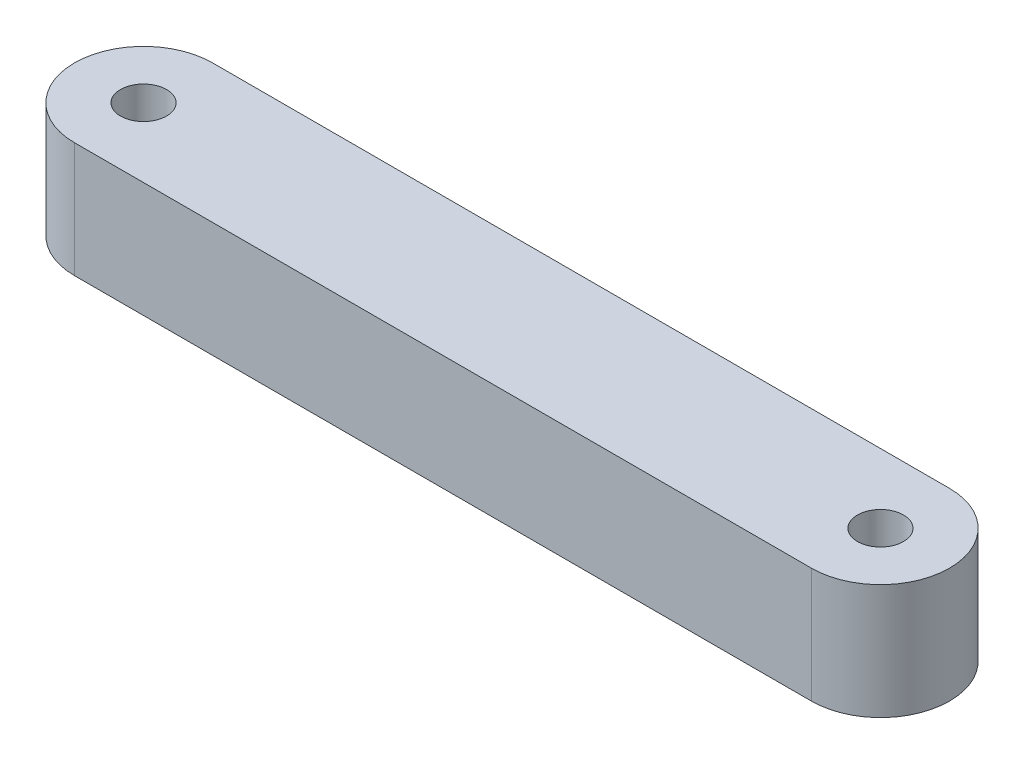
ISO-10303-21;
HEADER;
FILE_DESCRIPTION(('STEP AP214'),'2;1');
FILE_NAME('part.step','',(''),(''),'','','');
FILE_SCHEMA(('AUTOMOTIVE_DESIGN { 1 0 10303 214 1 1 1 1 }'));
ENDSEC;
DATA;
#1=APPLICATION_CONTEXT('core data for automotive mechanical design processes');
#2=APPLICATION_PROTOCOL_DEFINITION('international standard','automotive_design',2000,#1);
#3=PRODUCT_CONTEXT('',#1,'mechanical');
#4=PRODUCT('Part','Part','',(#3));
#5=PRODUCT_RELATED_PRODUCT_CATEGORY('part','',(#4));
#6=PRODUCT_DEFINITION_FORMATION('','',#4);
#7=PRODUCT_DEFINITION_CONTEXT('part definition',#1,'design');
#8=PRODUCT_DEFINITION('design','',#6,#7);
#9=PRODUCT_DEFINITION_SHAPE('','',#8);
#10=(LENGTH_UNIT() NAMED_UNIT(*) SI_UNIT(.MILLI.,.METRE.));
#11=(NAMED_UNIT(*) PLANE_ANGLE_UNIT() SI_UNIT($,.RADIAN.));
#12=(NAMED_UNIT(*) SI_UNIT($,.STERADIAN.) SOLID_ANGLE_UNIT());
#13=UNCERTAINTY_MEASURE_WITH_UNIT(LENGTH_MEASURE(1.E-05),#10,'distance_accuracy_value','');
#14=(GEOMETRIC_REPRESENTATION_CONTEXT(3) GLOBAL_UNCERTAINTY_ASSIGNED_CONTEXT((#13)) GLOBAL_UNIT_ASSIGNED_CONTEXT((#10,
#11,#12)) REPRESENTATION_CONTEXT('',''));
#15=CARTESIAN_POINT('',(0.,0.,0.));
#16=DIRECTION('',(0.,0.,1.));
#17=DIRECTION('',(1.,0.,0.));
#18=AXIS2_PLACEMENT_3D('',#15,#16,#17);
#19=CARTESIAN_POINT('',(-50.8,12.7,0.));
#20=DIRECTION('',(0.,-1.,0.));
#21=DIRECTION('',(0.,0.,-1.));
#22=AXIS2_PLACEMENT_3D('',#19,#20,#21);
#23=CYLINDRICAL_SURFACE('',#22,7.62);
#24=CARTESIAN_POINT('',(-50.8,0.,0.));
#25=DIRECTION('',(0.,1.,0.));
#26=DIRECTION('',(0.,0.,1.));
#27=AXIS2_PLACEMENT_3D('',#24,#25,#26);
#28=CIRCLE('',#27,7.62);
#29=CARTESIAN_POINT('',(-50.8,0.,-7.62));
#30=VERTEX_POINT('',#29);
#31=CARTESIAN_POINT('',(-50.8,0.,7.62));
#32=VERTEX_POINT('',#31);
#33=EDGE_CURVE('E102',#30,#32,#28,.T.);
#34=ORIENTED_EDGE('',*,*,#33,.T.);
#35=DIRECTION('',(0.,-1.,0.));
#36=VECTOR('',#35,1.);
#37=CARTESIAN_POINT('',(-50.8,12.7,7.62));
#38=LINE('',#37,#36);
#39=CARTESIAN_POINT('',(-50.8,12.7,7.62));
#40=VERTEX_POINT('',#39);
#41=EDGE_CURVE('E11',#40,#32,#38,.T.);
#42=ORIENTED_EDGE('',*,*,#41,.F.);
#43=CARTESIAN_POINT('',(-50.8,12.7,0.));
#44=DIRECTION('',(0.,1.,0.));
#45=DIRECTION('',(0.,0.,1.));
#46=AXIS2_PLACEMENT_3D('',#43,#44,#45);
#47=CIRCLE('',#46,7.62);
#48=CARTESIAN_POINT('',(-50.8,12.7,-7.62));
#49=VERTEX_POINT('',#48);
#50=EDGE_CURVE('E90',#49,#40,#47,.T.);
#51=ORIENTED_EDGE('',*,*,#50,.F.);
#52=DIRECTION('',(0.,-1.,0.));
#53=VECTOR('',#52,1.);
#54=CARTESIAN_POINT('',(-50.8,12.7,-7.62));
#55=LINE('',#54,#53);
#56=EDGE_CURVE('E98',#49,#30,#55,.T.);
#57=ORIENTED_EDGE('',*,*,#56,.T.);
#58=EDGE_LOOP('',(#34,#42,#51,#57));
#59=FACE_BOUND('',#58,.T.);
#60=ADVANCED_FACE('F39',(#59),#23,.T.);
#61=CARTESIAN_POINT('',(-50.8,12.7,7.62));
#62=DIRECTION('',(0.,0.,-1.));
#63=DIRECTION('',(-1.,0.,0.));
#64=AXIS2_PLACEMENT_3D('',#61,#62,#63);
#65=PLANE('',#64);
#66=DIRECTION('',(1.,0.,0.));
#67=VECTOR('',#66,1.);
#68=CARTESIAN_POINT('',(-50.8,0.,7.62));
#69=LINE('',#68,#67);
#70=CARTESIAN_POINT('',(30.48,0.,7.62));
#71=VERTEX_POINT('',#70);
#72=EDGE_CURVE('E94',#32,#71,#69,.T.);
#73=ORIENTED_EDGE('',*,*,#72,.T.);
#74=DIRECTION('',(0.,-1.,0.));
#75=VECTOR('',#74,1.);
#76=CARTESIAN_POINT('',(30.48,12.7,7.62));
#77=LINE('',#76,#75);
#78=CARTESIAN_POINT('',(30.48,12.7,7.62));
#79=VERTEX_POINT('',#78);
#80=EDGE_CURVE('E47',#79,#71,#77,.T.);
#81=ORIENTED_EDGE('',*,*,#80,.F.);
#82=DIRECTION('',(1.,0.,0.));
#83=VECTOR('',#82,1.);
#84=CARTESIAN_POINT('',(-50.8,12.7,7.62));
#85=LINE('',#84,#83);
#86=EDGE_CURVE('E85',#40,#79,#85,.T.);
#87=ORIENTED_EDGE('',*,*,#86,.F.);
#88=ORIENTED_EDGE('',*,*,#41,.T.);
#89=EDGE_LOOP('',(#73,#81,#87,#88));
#90=FACE_BOUND('',#89,.T.);
#91=ADVANCED_FACE('F93',(#90),#65,.F.);
#92=CARTESIAN_POINT('',(30.48,12.7,0.));
#93=DIRECTION('',(0.,-1.,0.));
#94=DIRECTION('',(0.,0.,-1.));
#95=AXIS2_PLACEMENT_3D('',#92,#93,#94);
#96=CYLINDRICAL_SURFACE('',#95,7.62);
#97=CARTESIAN_POINT('',(30.48,0.,0.));
#98=DIRECTION('',(0.,1.,0.));
#99=DIRECTION('',(0.,0.,1.));
#100=AXIS2_PLACEMENT_3D('',#97,#98,#99);
#101=CIRCLE('',#100,7.62);
#102=CARTESIAN_POINT('',(30.48,0.,-7.62));
#103=VERTEX_POINT('',#102);
#104=EDGE_CURVE('E72',#71,#103,#101,.T.);
#105=ORIENTED_EDGE('',*,*,#104,.T.);
#106=DIRECTION('',(0.,-1.,0.));
#107=VECTOR('',#106,1.);
#108=CARTESIAN_POINT('',(30.48,12.7,-7.62));
#109=LINE('',#108,#107);
#110=CARTESIAN_POINT('',(30.48,12.7,-7.62));
#111=VERTEX_POINT('',#110);
#112=EDGE_CURVE('E95',#111,#103,#109,.T.);
#113=ORIENTED_EDGE('',*,*,#112,.F.);
#114=CARTESIAN_POINT('',(30.48,12.7,0.));
#115=DIRECTION('',(0.,1.,0.));
#116=DIRECTION('',(0.,0.,1.));
#117=AXIS2_PLACEMENT_3D('',#114,#115,#116);
#118=CIRCLE('',#117,7.62);
#119=EDGE_CURVE('E88',#79,#111,#118,.T.);
#120=ORIENTED_EDGE('',*,*,#119,.F.);
#121=ORIENTED_EDGE('',*,*,#80,.T.);
#122=EDGE_LOOP('',(#105,#113,#120,#121));
#123=FACE_BOUND('',#122,.T.);
#124=ADVANCED_FACE('F96',(#123),#96,.T.);
#125=CARTESIAN_POINT('',(-50.8,12.7,-7.62));
#126=DIRECTION('',(0.,0.,1.));
#127=DIRECTION('',(1.,0.,0.));
#128=AXIS2_PLACEMENT_3D('',#125,#126,#127);
#129=PLANE('',#128);
#130=DIRECTION('',(-1.,0.,0.));
#131=VECTOR('',#130,1.);
#132=CARTESIAN_POINT('',(-50.8,0.,-7.62));
#133=LINE('',#132,#131);
#134=EDGE_CURVE('E78',#103,#30,#133,.T.);
#135=ORIENTED_EDGE('',*,*,#134,.T.);
#136=ORIENTED_EDGE('',*,*,#56,.F.);
#137=DIRECTION('',(-1.,0.,0.));
#138=VECTOR('',#137,1.);
#139=CARTESIAN_POINT('',(-50.8,12.7,-7.62));
#140=LINE('',#139,#138);
#141=EDGE_CURVE('E55',#111,#49,#140,.T.);
#142=ORIENTED_EDGE('',*,*,#141,.F.);
#143=ORIENTED_EDGE('',*,*,#112,.T.);
#144=EDGE_LOOP('',(#135,#136,#142,#143));
#145=FACE_BOUND('',#144,.T.);
#146=ADVANCED_FACE('F110',(#145),#129,.F.);
#147=CARTESIAN_POINT('',(-50.8,12.7,0.));
#148=DIRECTION('',(0.,1.,0.));
#149=DIRECTION('',(0.,0.,1.));
#150=AXIS2_PLACEMENT_3D('',#147,#148,#149);
#151=PLANE('',#150);
#152=CARTESIAN_POINT('',(-50.8,12.7,0.));
#153=DIRECTION('',(0.,1.,0.));
#154=DIRECTION('',(0.,0.,1.));
#155=AXIS2_PLACEMENT_3D('',#152,#153,#154);
#156=CIRCLE('',#155,2.54);
#157=CARTESIAN_POINT('',(-50.8,12.7,2.54));
#158=VERTEX_POINT('',#157);
#159=EDGE_CURVE('E122',#158,#158,#156,.T.);
#160=ORIENTED_EDGE('',*,*,#159,.F.);
#161=EDGE_LOOP('',(#160));
#162=FACE_BOUND('',#161,.T.);
#163=CARTESIAN_POINT('',(30.48,12.7,0.));
#164=DIRECTION('',(0.,1.,0.));
#165=DIRECTION('',(0.,0.,-1.));
#166=AXIS2_PLACEMENT_3D('',#163,#164,#165);
#167=CIRCLE('',#166,2.54);
#168=CARTESIAN_POINT('',(30.48,12.7,-2.54));
#169=VERTEX_POINT('',#168);
#170=EDGE_CURVE('E119',#169,#169,#167,.T.);
#171=ORIENTED_EDGE('',*,*,#170,.F.);
#172=EDGE_LOOP('',(#171));
#173=FACE_BOUND('',#172,.T.);
#174=ORIENTED_EDGE('',*,*,#50,.T.);
#175=ORIENTED_EDGE('',*,*,#86,.T.);
#176=ORIENTED_EDGE('',*,*,#119,.T.);
#177=ORIENTED_EDGE('',*,*,#141,.T.);
#178=EDGE_LOOP('',(#174,#175,#176,#177));
#179=FACE_BOUND('',#178,.T.);
#180=ADVANCED_FACE('F86',(#162,#173,#179),#151,.T.);
#181=CARTESIAN_POINT('',(-50.8,0.,0.));
#182=DIRECTION('',(0.,1.,0.));
#183=DIRECTION('',(0.,0.,1.));
#184=AXIS2_PLACEMENT_3D('',#181,#182,#183);
#185=PLANE('',#184);
#186=CARTESIAN_POINT('',(-50.8,0.,0.));
#187=DIRECTION('',(0.,1.,0.));
#188=DIRECTION('',(0.,0.,1.));
#189=AXIS2_PLACEMENT_3D('',#186,#187,#188);
#190=CIRCLE('',#189,2.54);
#191=CARTESIAN_POINT('',(-50.8,0.,2.54));
#192=VERTEX_POINT('',#191);
#193=EDGE_CURVE('E105',#192,#192,#190,.T.);
#194=ORIENTED_EDGE('',*,*,#193,.T.);
#195=EDGE_LOOP('',(#194));
#196=FACE_BOUND('',#195,.T.);
#197=CARTESIAN_POINT('',(30.48,0.,0.));
#198=DIRECTION('',(0.,1.,0.));
#199=DIRECTION('',(0.,0.,-1.));
#200=AXIS2_PLACEMENT_3D('',#197,#198,#199);
#201=CIRCLE('',#200,2.54);
#202=CARTESIAN_POINT('',(30.48,0.,-2.54));
#203=VERTEX_POINT('',#202);
#204=EDGE_CURVE('E116',#203,#203,#201,.T.);
#205=ORIENTED_EDGE('',*,*,#204,.T.);
#206=EDGE_LOOP('',(#205));
#207=FACE_BOUND('',#206,.T.);
#208=ORIENTED_EDGE('',*,*,#33,.F.);
#209=ORIENTED_EDGE('',*,*,#134,.F.);
#210=ORIENTED_EDGE('',*,*,#104,.F.);
#211=ORIENTED_EDGE('',*,*,#72,.F.);
#212=EDGE_LOOP('',(#208,#209,#210,#211));
#213=FACE_BOUND('',#212,.T.);
#214=ADVANCED_FACE('F113',(#196,#207,#213),#185,.F.);
#215=CARTESIAN_POINT('',(30.48,0.,0.));
#216=DIRECTION('',(0.,1.,0.));
#217=DIRECTION('',(0.,0.,1.));
#218=AXIS2_PLACEMENT_3D('',#215,#216,#217);
#219=CYLINDRICAL_SURFACE('',#218,2.54);
#220=ORIENTED_EDGE('',*,*,#204,.F.);
#221=EDGE_LOOP('',(#220));
#222=FACE_BOUND('',#221,.T.);
#223=ORIENTED_EDGE('',*,*,#170,.T.);
#224=EDGE_LOOP('',(#223));
#225=FACE_BOUND('',#224,.T.);
#226=ADVANCED_FACE('F133',(#222,#225),#219,.F.);
#227=CARTESIAN_POINT('',(-50.8,0.,0.));
#228=DIRECTION('',(0.,1.,0.));
#229=DIRECTION('',(0.,0.,1.));
#230=AXIS2_PLACEMENT_3D('',#227,#228,#229);
#231=CYLINDRICAL_SURFACE('',#230,2.54);
#232=ORIENTED_EDGE('',*,*,#193,.F.);
#233=EDGE_LOOP('',(#232));
#234=FACE_BOUND('',#233,.T.);
#235=ORIENTED_EDGE('',*,*,#159,.T.);
#236=EDGE_LOOP('',(#235));
#237=FACE_BOUND('',#236,.T.);
#238=ADVANCED_FACE('F130',(#234,#237),#231,.F.);
#239=CLOSED_SHELL('',(#60,#91,#124,#146,#180,#214,#226,#238));
#240=MANIFOLD_SOLID_BREP('B2',#239);
#241=ADVANCED_BREP_SHAPE_REPRESENTATION('',(#18,#240),#14);
#242=SHAPE_DEFINITION_REPRESENTATION(#9,#241);
ENDSEC;
END-ISO-10303-21;
